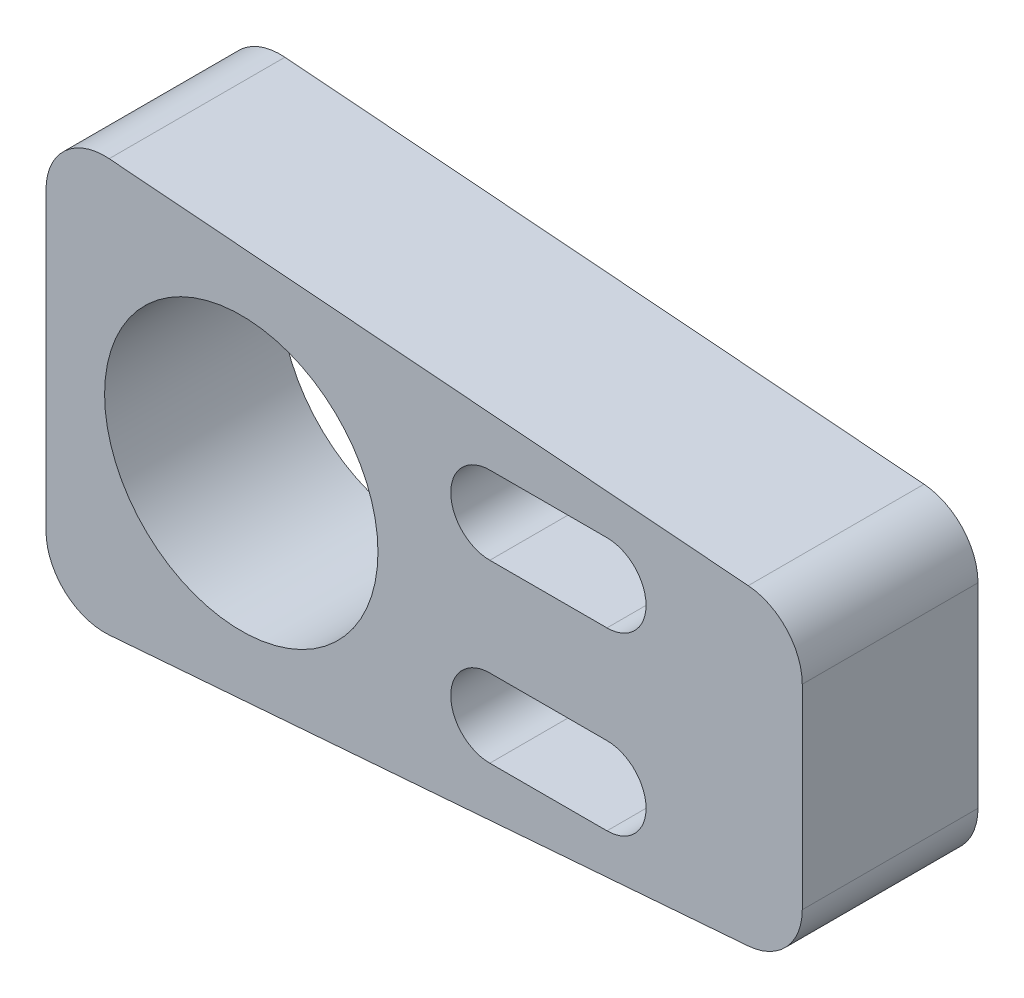
ISO-10303-21;
HEADER;
FILE_DESCRIPTION(('STEP AP214'),'2;1');
FILE_NAME('part.step','',(''),(''),'','','');
FILE_SCHEMA(('AUTOMOTIVE_DESIGN { 1 0 10303 214 1 1 1 1 }'));
ENDSEC;
DATA;
#1=APPLICATION_CONTEXT('core data for automotive mechanical design processes');
#2=APPLICATION_PROTOCOL_DEFINITION('international standard','automotive_design',2000,#1);
#3=PRODUCT_CONTEXT('',#1,'mechanical');
#4=PRODUCT('Part','Part','',(#3));
#5=PRODUCT_RELATED_PRODUCT_CATEGORY('part','',(#4));
#6=PRODUCT_DEFINITION_FORMATION('','',#4);
#7=PRODUCT_DEFINITION_CONTEXT('part definition',#1,'design');
#8=PRODUCT_DEFINITION('design','',#6,#7);
#9=PRODUCT_DEFINITION_SHAPE('','',#8);
#10=(LENGTH_UNIT() NAMED_UNIT(*) SI_UNIT(.MILLI.,.METRE.));
#11=(NAMED_UNIT(*) PLANE_ANGLE_UNIT() SI_UNIT($,.RADIAN.));
#12=(NAMED_UNIT(*) SI_UNIT($,.STERADIAN.) SOLID_ANGLE_UNIT());
#13=UNCERTAINTY_MEASURE_WITH_UNIT(LENGTH_MEASURE(1.E-05),#10,'distance_accuracy_value','');
#14=(GEOMETRIC_REPRESENTATION_CONTEXT(3) GLOBAL_UNCERTAINTY_ASSIGNED_CONTEXT((#13)) GLOBAL_UNIT_ASSIGNED_CONTEXT((#10,
#11,#12)) REPRESENTATION_CONTEXT('',''));
#15=CARTESIAN_POINT('',(0.,0.,0.));
#16=DIRECTION('',(0.,0.,1.));
#17=DIRECTION('',(1.,0.,0.));
#18=AXIS2_PLACEMENT_3D('',#15,#16,#17);
#19=CARTESIAN_POINT('',(0.,6.5,9.));
#20=DIRECTION('',(0.,-1.,0.));
#21=DIRECTION('',(0.,0.,-1.));
#22=AXIS2_PLACEMENT_3D('',#19,#20,#21);
#23=PLANE('',#22);
#24=DIRECTION('',(-1.,0.,0.));
#25=VECTOR('',#24,1.);
#26=CARTESIAN_POINT('',(0.,6.5,0.));
#27=LINE('',#26,#25);
#28=CARTESIAN_POINT('',(-114.44851042793,6.5,0.));
#29=VERTEX_POINT('',#28);
#30=CARTESIAN_POINT('',(-120.44851042793,6.5,0.));
#31=VERTEX_POINT('',#30);
#32=EDGE_CURVE('E219',#29,#31,#27,.T.);
#33=ORIENTED_EDGE('',*,*,#32,.F.);
#34=DIRECTION('',(0.,0.,-1.));
#35=VECTOR('',#34,1.);
#36=CARTESIAN_POINT('',(-114.44851042793,6.5,9.));
#37=LINE('',#36,#35);
#38=CARTESIAN_POINT('',(-114.44851042793,6.5,9.));
#39=VERTEX_POINT('',#38);
#40=EDGE_CURVE('E11',#39,#29,#37,.T.);
#41=ORIENTED_EDGE('',*,*,#40,.F.);
#42=DIRECTION('',(-1.,0.,0.));
#43=VECTOR('',#42,1.);
#44=CARTESIAN_POINT('',(0.,6.5,9.));
#45=LINE('',#44,#43);
#46=CARTESIAN_POINT('',(-120.44851042793,6.5,9.));
#47=VERTEX_POINT('',#46);
#48=EDGE_CURVE('E174',#39,#47,#45,.T.);
#49=ORIENTED_EDGE('',*,*,#48,.T.);
#50=DIRECTION('',(0.,0.,-1.));
#51=VECTOR('',#50,1.);
#52=CARTESIAN_POINT('',(-120.44851042793,6.5,9.));
#53=LINE('',#52,#51);
#54=EDGE_CURVE('E54',#47,#31,#53,.T.);
#55=ORIENTED_EDGE('',*,*,#54,.T.);
#56=EDGE_LOOP('',(#33,#41,#49,#55));
#57=FACE_BOUND('',#56,.T.);
#58=ADVANCED_FACE('F35',(#57),#23,.T.);
#59=CARTESIAN_POINT('',(-114.44851042793,4.5,9.));
#60=DIRECTION('',(0.,0.,-1.));
#61=DIRECTION('',(-1.,0.,0.));
#62=AXIS2_PLACEMENT_3D('',#59,#60,#61);
#63=CYLINDRICAL_SURFACE('',#62,2.);
#64=CARTESIAN_POINT('',(-114.44851042793,4.5,0.));
#65=DIRECTION('',(0.,0.,1.));
#66=DIRECTION('',(1.,0.,0.));
#67=AXIS2_PLACEMENT_3D('',#64,#65,#66);
#68=CIRCLE('',#67,2.);
#69=CARTESIAN_POINT('',(-114.44851042793,2.5,0.));
#70=VERTEX_POINT('',#69);
#71=EDGE_CURVE('E161',#70,#29,#68,.T.);
#72=ORIENTED_EDGE('',*,*,#71,.F.);
#73=DIRECTION('',(0.,0.,-1.));
#74=VECTOR('',#73,1.);
#75=CARTESIAN_POINT('',(-114.44851042793,2.5,9.));
#76=LINE('',#75,#74);
#77=CARTESIAN_POINT('',(-114.44851042793,2.5,9.));
#78=VERTEX_POINT('',#77);
#79=EDGE_CURVE('E45',#78,#70,#76,.T.);
#80=ORIENTED_EDGE('',*,*,#79,.F.);
#81=CARTESIAN_POINT('',(-114.44851042793,4.5,9.));
#82=DIRECTION('',(0.,0.,1.));
#83=DIRECTION('',(1.,0.,0.));
#84=AXIS2_PLACEMENT_3D('',#81,#82,#83);
#85=CIRCLE('',#84,2.);
#86=EDGE_CURVE('E159',#78,#39,#85,.T.);
#87=ORIENTED_EDGE('',*,*,#86,.T.);
#88=ORIENTED_EDGE('',*,*,#40,.T.);
#89=EDGE_LOOP('',(#72,#80,#87,#88));
#90=FACE_BOUND('',#89,.T.);
#91=ADVANCED_FACE('F157',(#90),#63,.F.);
#92=CARTESIAN_POINT('',(0.,2.5,9.));
#93=DIRECTION('',(0.,-1.,0.));
#94=DIRECTION('',(0.,0.,-1.));
#95=AXIS2_PLACEMENT_3D('',#92,#93,#94);
#96=PLANE('',#95);
#97=DIRECTION('',(-1.,0.,0.));
#98=VECTOR('',#97,1.);
#99=CARTESIAN_POINT('',(0.,2.5,0.));
#100=LINE('',#99,#98);
#101=CARTESIAN_POINT('',(-120.44851042793,2.5,0.));
#102=VERTEX_POINT('',#101);
#103=EDGE_CURVE('E222',#70,#102,#100,.T.);
#104=ORIENTED_EDGE('',*,*,#103,.T.);
#105=DIRECTION('',(0.,0.,-1.));
#106=VECTOR('',#105,1.);
#107=CARTESIAN_POINT('',(-120.44851042793,2.5,9.));
#108=LINE('',#107,#106);
#109=CARTESIAN_POINT('',(-120.44851042793,2.5,9.));
#110=VERTEX_POINT('',#109);
#111=EDGE_CURVE('E104',#110,#102,#108,.T.);
#112=ORIENTED_EDGE('',*,*,#111,.F.);
#113=DIRECTION('',(-1.,0.,0.));
#114=VECTOR('',#113,1.);
#115=CARTESIAN_POINT('',(0.,2.5,9.));
#116=LINE('',#115,#114);
#117=EDGE_CURVE('E165',#78,#110,#116,.T.);
#118=ORIENTED_EDGE('',*,*,#117,.F.);
#119=ORIENTED_EDGE('',*,*,#79,.T.);
#120=EDGE_LOOP('',(#104,#112,#118,#119));
#121=FACE_BOUND('',#120,.T.);
#122=ADVANCED_FACE('F166',(#121),#96,.F.);
#123=CARTESIAN_POINT('',(-120.44851042793,-4.5,9.));
#124=DIRECTION('',(0.,0.,-1.));
#125=DIRECTION('',(-1.,0.,0.));
#126=AXIS2_PLACEMENT_3D('',#123,#124,#125);
#127=CYLINDRICAL_SURFACE('',#126,2.);
#128=CARTESIAN_POINT('',(-120.44851042793,-4.5,0.));
#129=DIRECTION('',(0.,0.,1.));
#130=DIRECTION('',(1.,0.,0.));
#131=AXIS2_PLACEMENT_3D('',#128,#129,#130);
#132=CIRCLE('',#131,2.);
#133=CARTESIAN_POINT('',(-120.44851042793,-2.5,0.));
#134=VERTEX_POINT('',#133);
#135=CARTESIAN_POINT('',(-120.44851042793,-6.50000000000001,0.));
#136=VERTEX_POINT('',#135);
#137=EDGE_CURVE('E207',#134,#136,#132,.T.);
#138=ORIENTED_EDGE('',*,*,#137,.F.);
#139=DIRECTION('',(0.,0.,-1.));
#140=VECTOR('',#139,1.);
#141=CARTESIAN_POINT('',(-120.44851042793,-2.5,9.));
#142=LINE('',#141,#140);
#143=CARTESIAN_POINT('',(-120.44851042793,-2.5,9.));
#144=VERTEX_POINT('',#143);
#145=EDGE_CURVE('E232',#144,#134,#142,.T.);
#146=ORIENTED_EDGE('',*,*,#145,.F.);
#147=CARTESIAN_POINT('',(-120.44851042793,-4.5,9.));
#148=DIRECTION('',(0.,0.,1.));
#149=DIRECTION('',(1.,0.,0.));
#150=AXIS2_PLACEMENT_3D('',#147,#148,#149);
#151=CIRCLE('',#150,2.);
#152=CARTESIAN_POINT('',(-120.44851042793,-6.50000000000001,9.));
#153=VERTEX_POINT('',#152);
#154=EDGE_CURVE('E293',#144,#153,#151,.T.);
#155=ORIENTED_EDGE('',*,*,#154,.T.);
#156=DIRECTION('',(0.,0.,-1.));
#157=VECTOR('',#156,1.);
#158=CARTESIAN_POINT('',(-120.44851042793,-6.50000000000001,9.));
#159=LINE('',#158,#157);
#160=EDGE_CURVE('E234',#153,#136,#159,.T.);
#161=ORIENTED_EDGE('',*,*,#160,.T.);
#162=EDGE_LOOP('',(#138,#146,#155,#161));
#163=FACE_BOUND('',#162,.T.);
#164=ADVANCED_FACE('F311',(#163),#127,.F.);
#165=CARTESIAN_POINT('',(0.,-2.5,9.));
#166=DIRECTION('',(0.,-1.,0.));
#167=DIRECTION('',(0.,0.,-1.));
#168=AXIS2_PLACEMENT_3D('',#165,#166,#167);
#169=PLANE('',#168);
#170=DIRECTION('',(-1.,0.,0.));
#171=VECTOR('',#170,1.);
#172=CARTESIAN_POINT('',(0.,-2.5,0.));
#173=LINE('',#172,#171);
#174=CARTESIAN_POINT('',(-114.44851042793,-2.5,0.));
#175=VERTEX_POINT('',#174);
#176=EDGE_CURVE('E210',#175,#134,#173,.T.);
#177=ORIENTED_EDGE('',*,*,#176,.F.);
#178=DIRECTION('',(0.,0.,-1.));
#179=VECTOR('',#178,1.);
#180=CARTESIAN_POINT('',(-114.44851042793,-2.5,9.));
#181=LINE('',#180,#179);
#182=CARTESIAN_POINT('',(-114.44851042793,-2.5,9.));
#183=VERTEX_POINT('',#182);
#184=EDGE_CURVE('E238',#183,#175,#181,.T.);
#185=ORIENTED_EDGE('',*,*,#184,.F.);
#186=DIRECTION('',(-1.,0.,0.));
#187=VECTOR('',#186,1.);
#188=CARTESIAN_POINT('',(0.,-2.5,9.));
#189=LINE('',#188,#187);
#190=EDGE_CURVE('E296',#183,#144,#189,.T.);
#191=ORIENTED_EDGE('',*,*,#190,.T.);
#192=ORIENTED_EDGE('',*,*,#145,.T.);
#193=EDGE_LOOP('',(#177,#185,#191,#192));
#194=FACE_BOUND('',#193,.T.);
#195=ADVANCED_FACE('F314',(#194),#169,.T.);
#196=CARTESIAN_POINT('',(-114.44851042793,-4.5,9.));
#197=DIRECTION('',(0.,0.,-1.));
#198=DIRECTION('',(-1.,0.,0.));
#199=AXIS2_PLACEMENT_3D('',#196,#197,#198);
#200=CYLINDRICAL_SURFACE('',#199,2.);
#201=CARTESIAN_POINT('',(-114.44851042793,-4.5,0.));
#202=DIRECTION('',(0.,0.,1.));
#203=DIRECTION('',(1.,0.,0.));
#204=AXIS2_PLACEMENT_3D('',#201,#202,#203);
#205=CIRCLE('',#204,2.);
#206=CARTESIAN_POINT('',(-114.44851042793,-6.50000000000001,0.));
#207=VERTEX_POINT('',#206);
#208=EDGE_CURVE('E213',#207,#175,#205,.T.);
#209=ORIENTED_EDGE('',*,*,#208,.F.);
#210=DIRECTION('',(0.,0.,-1.));
#211=VECTOR('',#210,1.);
#212=CARTESIAN_POINT('',(-114.44851042793,-6.50000000000001,9.));
#213=LINE('',#212,#211);
#214=CARTESIAN_POINT('',(-114.44851042793,-6.50000000000001,9.));
#215=VERTEX_POINT('',#214);
#216=EDGE_CURVE('E236',#215,#207,#213,.T.);
#217=ORIENTED_EDGE('',*,*,#216,.F.);
#218=CARTESIAN_POINT('',(-114.44851042793,-4.5,9.));
#219=DIRECTION('',(0.,0.,1.));
#220=DIRECTION('',(1.,0.,0.));
#221=AXIS2_PLACEMENT_3D('',#218,#219,#220);
#222=CIRCLE('',#221,2.);
#223=EDGE_CURVE('E299',#215,#183,#222,.T.);
#224=ORIENTED_EDGE('',*,*,#223,.T.);
#225=ORIENTED_EDGE('',*,*,#184,.T.);
#226=EDGE_LOOP('',(#209,#217,#224,#225));
#227=FACE_BOUND('',#226,.T.);
#228=ADVANCED_FACE('F317',(#227),#200,.F.);
#229=CARTESIAN_POINT('',(-0.0338563368697226,-0.430878293590904,9.));
#230=DIRECTION('',(0.0783337275643138,0.996927192489943,0.));
#231=DIRECTION('',(-0.996927192489943,0.0783337275643138,0.));
#232=AXIS2_PLACEMENT_3D('',#229,#230,#231);
#233=PLANE('',#232);
#234=DIRECTION('',(0.996927192489943,-0.0783337275643138,0.));
#235=VECTOR('',#234,1.);
#236=CARTESIAN_POINT('',(-0.0338563368697226,-0.430878293590904,0.));
#237=LINE('',#236,#235);
#238=CARTESIAN_POINT('',(-139.941431306595,10.562383746428,0.));
#239=VERTEX_POINT('',#238);
#240=CARTESIAN_POINT('',(-107.213509245237,7.99078157746983,0.));
#241=VERTEX_POINT('',#240);
#242=EDGE_CURVE('E185',#239,#241,#237,.T.);
#243=ORIENTED_EDGE('',*,*,#242,.F.);
#244=DIRECTION('',(0.,0.,-1.));
#245=VECTOR('',#244,1.);
#246=CARTESIAN_POINT('',(-139.941431306595,10.562383746428,9.));
#247=LINE('',#246,#245);
#248=CARTESIAN_POINT('',(-139.941431306595,10.562383746428,9.));
#249=VERTEX_POINT('',#248);
#250=EDGE_CURVE('E39',#249,#239,#247,.T.);
#251=ORIENTED_EDGE('',*,*,#250,.F.);
#252=DIRECTION('',(0.996927192489943,-0.0783337275643138,0.));
#253=VECTOR('',#252,1.);
#254=CARTESIAN_POINT('',(-0.0338563368697226,-0.430878293590904,9.));
#255=LINE('',#254,#253);
#256=CARTESIAN_POINT('',(-107.213509245237,7.99078157746983,9.));
#257=VERTEX_POINT('',#256);
#258=EDGE_CURVE('E230',#249,#257,#255,.T.);
#259=ORIENTED_EDGE('',*,*,#258,.T.);
#260=DIRECTION('',(0.,0.,-1.));
#261=VECTOR('',#260,1.);
#262=CARTESIAN_POINT('',(-107.213509245237,7.99078157746983,9.));
#263=LINE('',#262,#261);
#264=EDGE_CURVE('E184',#257,#241,#263,.T.);
#265=ORIENTED_EDGE('',*,*,#264,.T.);
#266=EDGE_LOOP('',(#243,#251,#259,#265));
#267=FACE_BOUND('',#266,.T.);
#268=ADVANCED_FACE('F37',(#267),#233,.T.);
#269=CARTESIAN_POINT('',(-140.176432489288,7.57160216895814,9.));
#270=DIRECTION('',(0.,0.,-1.));
#271=DIRECTION('',(-1.,0.,0.));
#272=AXIS2_PLACEMENT_3D('',#269,#270,#271);
#273=CYLINDRICAL_SURFACE('',#272,3.00000000000001);
#274=CARTESIAN_POINT('',(-140.176432489288,7.57160216895814,0.));
#275=DIRECTION('',(0.,0.,1.));
#276=DIRECTION('',(1.,0.,0.));
#277=AXIS2_PLACEMENT_3D('',#274,#275,#276);
#278=CIRCLE('',#277,3.00000000000001);
#279=CARTESIAN_POINT('',(-143.176432489288,7.57160216895814,0.));
#280=VERTEX_POINT('',#279);
#281=EDGE_CURVE('E188',#280,#239,#278,.F.);
#282=ORIENTED_EDGE('',*,*,#281,.F.);
#283=DIRECTION('',(0.,0.,-1.));
#284=VECTOR('',#283,1.);
#285=CARTESIAN_POINT('',(-143.176432489288,7.57160216895814,9.));
#286=LINE('',#285,#284);
#287=CARTESIAN_POINT('',(-143.176432489288,7.57160216895814,9.));
#288=VERTEX_POINT('',#287);
#289=EDGE_CURVE('E253',#288,#280,#286,.T.);
#290=ORIENTED_EDGE('',*,*,#289,.F.);
#291=CARTESIAN_POINT('',(-140.176432489288,7.57160216895814,9.));
#292=DIRECTION('',(0.,0.,1.));
#293=DIRECTION('',(1.,0.,0.));
#294=AXIS2_PLACEMENT_3D('',#291,#292,#293);
#295=CIRCLE('',#294,3.00000000000001);
#296=EDGE_CURVE('E262',#288,#249,#295,.F.);
#297=ORIENTED_EDGE('',*,*,#296,.T.);
#298=ORIENTED_EDGE('',*,*,#250,.T.);
#299=EDGE_LOOP('',(#282,#290,#297,#298));
#300=FACE_BOUND('',#299,.T.);
#301=ADVANCED_FACE('F260',(#300),#273,.T.);
#302=CARTESIAN_POINT('',(-143.176432489288,0.,9.));
#303=DIRECTION('',(-1.,0.,0.));
#304=DIRECTION('',(0.,0.,1.));
#305=AXIS2_PLACEMENT_3D('',#302,#303,#304);
#306=PLANE('',#305);
#307=DIRECTION('',(0.,1.,0.));
#308=VECTOR('',#307,1.);
#309=CARTESIAN_POINT('',(-143.176432489288,0.,0.));
#310=LINE('',#309,#308);
#311=CARTESIAN_POINT('',(-143.176432489288,-7.57160216895814,0.));
#312=VERTEX_POINT('',#311);
#313=EDGE_CURVE('E191',#312,#280,#310,.T.);
#314=ORIENTED_EDGE('',*,*,#313,.F.);
#315=DIRECTION('',(0.,0.,-1.));
#316=VECTOR('',#315,1.);
#317=CARTESIAN_POINT('',(-143.176432489288,-7.57160216895814,9.));
#318=LINE('',#317,#316);
#319=CARTESIAN_POINT('',(-143.176432489288,-7.57160216895814,9.));
#320=VERTEX_POINT('',#319);
#321=EDGE_CURVE('E252',#320,#312,#318,.T.);
#322=ORIENTED_EDGE('',*,*,#321,.F.);
#323=DIRECTION('',(0.,1.,0.));
#324=VECTOR('',#323,1.);
#325=CARTESIAN_POINT('',(-143.176432489288,0.,9.));
#326=LINE('',#325,#324);
#327=EDGE_CURVE('E271',#320,#288,#326,.T.);
#328=ORIENTED_EDGE('',*,*,#327,.T.);
#329=ORIENTED_EDGE('',*,*,#289,.T.);
#330=EDGE_LOOP('',(#314,#322,#328,#329));
#331=FACE_BOUND('',#330,.T.);
#332=ADVANCED_FACE('F269',(#331),#306,.T.);
#333=CARTESIAN_POINT('',(-140.176432489288,-7.57160216895814,9.));
#334=DIRECTION('',(0.,0.,-1.));
#335=DIRECTION('',(-1.,0.,0.));
#336=AXIS2_PLACEMENT_3D('',#333,#334,#335);
#337=CYLINDRICAL_SURFACE('',#336,3.00000000000001);
#338=CARTESIAN_POINT('',(-140.176432489288,-7.57160216895814,0.));
#339=DIRECTION('',(0.,0.,1.));
#340=DIRECTION('',(1.,0.,0.));
#341=AXIS2_PLACEMENT_3D('',#338,#339,#340);
#342=CIRCLE('',#341,3.00000000000001);
#343=CARTESIAN_POINT('',(-139.941431306595,-10.562383746428,0.));
#344=VERTEX_POINT('',#343);
#345=EDGE_CURVE('E194',#344,#312,#342,.F.);
#346=ORIENTED_EDGE('',*,*,#345,.F.);
#347=DIRECTION('',(0.,0.,-1.));
#348=VECTOR('',#347,1.);
#349=CARTESIAN_POINT('',(-139.941431306595,-10.562383746428,9.));
#350=LINE('',#349,#348);
#351=CARTESIAN_POINT('',(-139.941431306595,-10.562383746428,9.));
#352=VERTEX_POINT('',#351);
#353=EDGE_CURVE('E250',#352,#344,#350,.T.);
#354=ORIENTED_EDGE('',*,*,#353,.F.);
#355=CARTESIAN_POINT('',(-140.176432489288,-7.57160216895814,9.));
#356=DIRECTION('',(0.,0.,1.));
#357=DIRECTION('',(1.,0.,0.));
#358=AXIS2_PLACEMENT_3D('',#355,#356,#357);
#359=CIRCLE('',#358,3.00000000000001);
#360=EDGE_CURVE('E277',#352,#320,#359,.F.);
#361=ORIENTED_EDGE('',*,*,#360,.T.);
#362=ORIENTED_EDGE('',*,*,#321,.T.);
#363=EDGE_LOOP('',(#346,#354,#361,#362));
#364=FACE_BOUND('',#363,.T.);
#365=ADVANCED_FACE('F279',(#364),#337,.T.);
#366=CARTESIAN_POINT('',(-0.0338563368697223,0.430878293590901,9.));
#367=DIRECTION('',(-0.0783337275643138,0.996927192489943,0.));
#368=DIRECTION('',(-0.996927192489943,-0.0783337275643138,0.));
#369=AXIS2_PLACEMENT_3D('',#366,#367,#368);
#370=PLANE('',#369);
#371=DIRECTION('',(0.996927192489943,0.0783337275643138,0.));
#372=VECTOR('',#371,1.);
#373=CARTESIAN_POINT('',(-0.0338563368697223,0.430878293590901,0.));
#374=LINE('',#373,#372);
#375=CARTESIAN_POINT('',(-107.213509245237,-7.99078157746983,0.));
#376=VERTEX_POINT('',#375);
#377=EDGE_CURVE('E197',#344,#376,#374,.T.);
#378=ORIENTED_EDGE('',*,*,#377,.T.);
#379=DIRECTION('',(0.,0.,-1.));
#380=VECTOR('',#379,1.);
#381=CARTESIAN_POINT('',(-107.213509245237,-7.99078157746983,9.));
#382=LINE('',#381,#380);
#383=CARTESIAN_POINT('',(-107.213509245237,-7.99078157746983,9.));
#384=VERTEX_POINT('',#383);
#385=EDGE_CURVE('E247',#384,#376,#382,.T.);
#386=ORIENTED_EDGE('',*,*,#385,.F.);
#387=DIRECTION('',(0.996927192489943,0.0783337275643138,0.));
#388=VECTOR('',#387,1.);
#389=CARTESIAN_POINT('',(-0.0338563368697223,0.430878293590901,9.));
#390=LINE('',#389,#388);
#391=EDGE_CURVE('E281',#352,#384,#390,.T.);
#392=ORIENTED_EDGE('',*,*,#391,.F.);
#393=ORIENTED_EDGE('',*,*,#353,.T.);
#394=EDGE_LOOP('',(#378,#386,#392,#393));
#395=FACE_BOUND('',#394,.T.);
#396=ADVANCED_FACE('F361',(#395),#370,.F.);
#397=CARTESIAN_POINT('',(-107.44851042793,-5.,9.));
#398=DIRECTION('',(0.,0.,-1.));
#399=DIRECTION('',(-1.,0.,0.));
#400=AXIS2_PLACEMENT_3D('',#397,#398,#399);
#401=CYLINDRICAL_SURFACE('',#400,3.);
#402=CARTESIAN_POINT('',(-107.44851042793,-5.,0.));
#403=DIRECTION('',(0.,0.,1.));
#404=DIRECTION('',(1.,0.,0.));
#405=AXIS2_PLACEMENT_3D('',#402,#403,#404);
#406=CIRCLE('',#405,3.);
#407=CARTESIAN_POINT('',(-104.44851042793,-5.,0.));
#408=VERTEX_POINT('',#407);
#409=EDGE_CURVE('E199',#376,#408,#406,.T.);
#410=ORIENTED_EDGE('',*,*,#409,.T.);
#411=DIRECTION('',(0.,0.,-1.));
#412=VECTOR('',#411,1.);
#413=CARTESIAN_POINT('',(-104.44851042793,-5.,9.));
#414=LINE('',#413,#412);
#415=CARTESIAN_POINT('',(-104.44851042793,-5.,9.));
#416=VERTEX_POINT('',#415);
#417=EDGE_CURVE('E244',#416,#408,#414,.T.);
#418=ORIENTED_EDGE('',*,*,#417,.F.);
#419=CARTESIAN_POINT('',(-107.44851042793,-5.,9.));
#420=DIRECTION('',(0.,0.,1.));
#421=DIRECTION('',(1.,0.,0.));
#422=AXIS2_PLACEMENT_3D('',#419,#420,#421);
#423=CIRCLE('',#422,3.);
#424=EDGE_CURVE('E283',#384,#416,#423,.T.);
#425=ORIENTED_EDGE('',*,*,#424,.F.);
#426=ORIENTED_EDGE('',*,*,#385,.T.);
#427=EDGE_LOOP('',(#410,#418,#425,#426));
#428=FACE_BOUND('',#427,.T.);
#429=ADVANCED_FACE('F357',(#428),#401,.T.);
#430=CARTESIAN_POINT('',(-104.44851042793,0.,9.));
#431=DIRECTION('',(-1.,0.,0.));
#432=DIRECTION('',(0.,0.,1.));
#433=AXIS2_PLACEMENT_3D('',#430,#431,#432);
#434=PLANE('',#433);
#435=DIRECTION('',(0.,1.,0.));
#436=VECTOR('',#435,1.);
#437=CARTESIAN_POINT('',(-104.44851042793,0.,0.));
#438=LINE('',#437,#436);
#439=CARTESIAN_POINT('',(-104.44851042793,5.,0.));
#440=VERTEX_POINT('',#439);
#441=EDGE_CURVE('E201',#408,#440,#438,.T.);
#442=ORIENTED_EDGE('',*,*,#441,.T.);
#443=DIRECTION('',(0.,0.,-1.));
#444=VECTOR('',#443,1.);
#445=CARTESIAN_POINT('',(-104.44851042793,5.,9.));
#446=LINE('',#445,#444);
#447=CARTESIAN_POINT('',(-104.44851042793,5.,9.));
#448=VERTEX_POINT('',#447);
#449=EDGE_CURVE('E242',#448,#440,#446,.T.);
#450=ORIENTED_EDGE('',*,*,#449,.F.);
#451=DIRECTION('',(0.,1.,0.));
#452=VECTOR('',#451,1.);
#453=CARTESIAN_POINT('',(-104.44851042793,0.,9.));
#454=LINE('',#453,#452);
#455=EDGE_CURVE('E288',#416,#448,#454,.T.);
#456=ORIENTED_EDGE('',*,*,#455,.F.);
#457=ORIENTED_EDGE('',*,*,#417,.T.);
#458=EDGE_LOOP('',(#442,#450,#456,#457));
#459=FACE_BOUND('',#458,.T.);
#460=ADVANCED_FACE('F354',(#459),#434,.F.);
#461=CARTESIAN_POINT('',(-120.44851042793,4.5,9.));
#462=DIRECTION('',(0.,0.,-1.));
#463=DIRECTION('',(-1.,0.,0.));
#464=AXIS2_PLACEMENT_3D('',#461,#462,#463);
#465=CYLINDRICAL_SURFACE('',#464,2.);
#466=CARTESIAN_POINT('',(-120.44851042793,4.5,0.));
#467=DIRECTION('',(0.,0.,1.));
#468=DIRECTION('',(1.,0.,0.));
#469=AXIS2_PLACEMENT_3D('',#466,#467,#468);
#470=CIRCLE('',#469,2.);
#471=EDGE_CURVE('E224',#31,#102,#470,.T.);
#472=ORIENTED_EDGE('',*,*,#471,.F.);
#473=ORIENTED_EDGE('',*,*,#54,.F.);
#474=CARTESIAN_POINT('',(-120.44851042793,4.5,9.));
#475=DIRECTION('',(0.,0.,1.));
#476=DIRECTION('',(1.,0.,0.));
#477=AXIS2_PLACEMENT_3D('',#474,#475,#476);
#478=CIRCLE('',#477,2.);
#479=EDGE_CURVE('E169',#47,#110,#478,.T.);
#480=ORIENTED_EDGE('',*,*,#479,.T.);
#481=ORIENTED_EDGE('',*,*,#111,.T.);
#482=EDGE_LOOP('',(#472,#473,#480,#481));
#483=FACE_BOUND('',#482,.T.);
#484=ADVANCED_FACE('F347',(#483),#465,.F.);
#485=CARTESIAN_POINT('',(0.,-6.50000000000001,9.));
#486=DIRECTION('',(0.,-1.,0.));
#487=DIRECTION('',(0.,0.,-1.));
#488=AXIS2_PLACEMENT_3D('',#485,#486,#487);
#489=PLANE('',#488);
#490=DIRECTION('',(-1.,0.,0.));
#491=VECTOR('',#490,1.);
#492=CARTESIAN_POINT('',(0.,-6.50000000000001,0.));
#493=LINE('',#492,#491);
#494=EDGE_CURVE('E216',#207,#136,#493,.T.);
#495=ORIENTED_EDGE('',*,*,#494,.T.);
#496=ORIENTED_EDGE('',*,*,#160,.F.);
#497=DIRECTION('',(-1.,0.,0.));
#498=VECTOR('',#497,1.);
#499=CARTESIAN_POINT('',(0.,-6.50000000000001,9.));
#500=LINE('',#499,#498);
#501=EDGE_CURVE('E176',#215,#153,#500,.T.);
#502=ORIENTED_EDGE('',*,*,#501,.F.);
#503=ORIENTED_EDGE('',*,*,#216,.T.);
#504=EDGE_LOOP('',(#495,#496,#502,#503));
#505=FACE_BOUND('',#504,.T.);
#506=ADVANCED_FACE('F307',(#505),#489,.F.);
#507=CARTESIAN_POINT('',(-107.44851042793,5.,9.));
#508=DIRECTION('',(0.,0.,-1.));
#509=DIRECTION('',(-1.,0.,0.));
#510=AXIS2_PLACEMENT_3D('',#507,#508,#509);
#511=CYLINDRICAL_SURFACE('',#510,3.);
#512=CARTESIAN_POINT('',(-107.44851042793,5.,0.));
#513=DIRECTION('',(0.,0.,1.));
#514=DIRECTION('',(1.,0.,0.));
#515=AXIS2_PLACEMENT_3D('',#512,#513,#514);
#516=CIRCLE('',#515,3.);
#517=EDGE_CURVE('E204',#241,#440,#516,.F.);
#518=ORIENTED_EDGE('',*,*,#517,.F.);
#519=ORIENTED_EDGE('',*,*,#264,.F.);
#520=CARTESIAN_POINT('',(-107.44851042793,5.,9.));
#521=DIRECTION('',(0.,0.,1.));
#522=DIRECTION('',(1.,0.,0.));
#523=AXIS2_PLACEMENT_3D('',#520,#521,#522);
#524=CIRCLE('',#523,3.);
#525=EDGE_CURVE('E290',#257,#448,#524,.F.);
#526=ORIENTED_EDGE('',*,*,#525,.T.);
#527=ORIENTED_EDGE('',*,*,#449,.T.);
#528=EDGE_LOOP('',(#518,#519,#526,#527));
#529=FACE_BOUND('',#528,.T.);
#530=ADVANCED_FACE('F326',(#529),#511,.T.);
#531=CARTESIAN_POINT('',(-133.176432489288,0.,9.));
#532=DIRECTION('',(0.,0.,-1.));
#533=DIRECTION('',(-1.,0.,0.));
#534=AXIS2_PLACEMENT_3D('',#531,#532,#533);
#535=CYLINDRICAL_SURFACE('',#534,7.00000000000001);
#536=CARTESIAN_POINT('',(-133.176432489288,0.,9.));
#537=DIRECTION('',(0.,0.,1.));
#538=DIRECTION('',(1.,0.,0.));
#539=AXIS2_PLACEMENT_3D('',#536,#537,#538);
#540=CIRCLE('',#539,7.00000000000001);
#541=CARTESIAN_POINT('',(-126.176432489288,0.,9.));
#542=VERTEX_POINT('',#541);
#543=EDGE_CURVE('E181',#542,#542,#540,.T.);
#544=ORIENTED_EDGE('',*,*,#543,.T.);
#545=EDGE_LOOP('',(#544));
#546=FACE_BOUND('',#545,.T.);
#547=CARTESIAN_POINT('',(-133.176432489288,0.,0.));
#548=DIRECTION('',(0.,0.,1.));
#549=DIRECTION('',(1.,0.,0.));
#550=AXIS2_PLACEMENT_3D('',#547,#548,#549);
#551=CIRCLE('',#550,7.00000000000001);
#552=CARTESIAN_POINT('',(-126.176432489288,0.,0.));
#553=VERTEX_POINT('',#552);
#554=EDGE_CURVE('E227',#553,#553,#551,.T.);
#555=ORIENTED_EDGE('',*,*,#554,.F.);
#556=EDGE_LOOP('',(#555));
#557=FACE_BOUND('',#556,.T.);
#558=ADVANCED_FACE('F324',(#546,#557),#535,.F.);
#559=CARTESIAN_POINT('',(0.,0.,9.));
#560=DIRECTION('',(0.,0.,1.));
#561=DIRECTION('',(1.,0.,0.));
#562=AXIS2_PLACEMENT_3D('',#559,#560,#561);
#563=PLANE('',#562);
#564=ORIENTED_EDGE('',*,*,#258,.F.);
#565=ORIENTED_EDGE('',*,*,#296,.F.);
#566=ORIENTED_EDGE('',*,*,#327,.F.);
#567=ORIENTED_EDGE('',*,*,#360,.F.);
#568=ORIENTED_EDGE('',*,*,#391,.T.);
#569=ORIENTED_EDGE('',*,*,#424,.T.);
#570=ORIENTED_EDGE('',*,*,#455,.T.);
#571=ORIENTED_EDGE('',*,*,#525,.F.);
#572=EDGE_LOOP('',(#564,#565,#566,#567,#568,#569,#570,#571));
#573=FACE_BOUND('',#572,.T.);
#574=ORIENTED_EDGE('',*,*,#154,.F.);
#575=ORIENTED_EDGE('',*,*,#190,.F.);
#576=ORIENTED_EDGE('',*,*,#223,.F.);
#577=ORIENTED_EDGE('',*,*,#501,.T.);
#578=EDGE_LOOP('',(#574,#575,#576,#577));
#579=FACE_BOUND('',#578,.T.);
#580=ORIENTED_EDGE('',*,*,#48,.F.);
#581=ORIENTED_EDGE('',*,*,#86,.F.);
#582=ORIENTED_EDGE('',*,*,#117,.T.);
#583=ORIENTED_EDGE('',*,*,#479,.F.);
#584=EDGE_LOOP('',(#580,#581,#582,#583));
#585=FACE_BOUND('',#584,.T.);
#586=ORIENTED_EDGE('',*,*,#543,.F.);
#587=EDGE_LOOP('',(#586));
#588=FACE_BOUND('',#587,.T.);
#589=ADVANCED_FACE('F172',(#573,#579,#585,#588),#563,.T.);
#590=CARTESIAN_POINT('',(0.,0.,0.));
#591=DIRECTION('',(0.,0.,1.));
#592=DIRECTION('',(1.,0.,0.));
#593=AXIS2_PLACEMENT_3D('',#590,#591,#592);
#594=PLANE('',#593);
#595=ORIENTED_EDGE('',*,*,#242,.T.);
#596=ORIENTED_EDGE('',*,*,#517,.T.);
#597=ORIENTED_EDGE('',*,*,#441,.F.);
#598=ORIENTED_EDGE('',*,*,#409,.F.);
#599=ORIENTED_EDGE('',*,*,#377,.F.);
#600=ORIENTED_EDGE('',*,*,#345,.T.);
#601=ORIENTED_EDGE('',*,*,#313,.T.);
#602=ORIENTED_EDGE('',*,*,#281,.T.);
#603=EDGE_LOOP('',(#595,#596,#597,#598,#599,#600,#601,#602));
#604=FACE_BOUND('',#603,.T.);
#605=ORIENTED_EDGE('',*,*,#137,.T.);
#606=ORIENTED_EDGE('',*,*,#494,.F.);
#607=ORIENTED_EDGE('',*,*,#208,.T.);
#608=ORIENTED_EDGE('',*,*,#176,.T.);
#609=EDGE_LOOP('',(#605,#606,#607,#608));
#610=FACE_BOUND('',#609,.T.);
#611=ORIENTED_EDGE('',*,*,#32,.T.);
#612=ORIENTED_EDGE('',*,*,#471,.T.);
#613=ORIENTED_EDGE('',*,*,#103,.F.);
#614=ORIENTED_EDGE('',*,*,#71,.T.);
#615=EDGE_LOOP('',(#611,#612,#613,#614));
#616=FACE_BOUND('',#615,.T.);
#617=ORIENTED_EDGE('',*,*,#554,.T.);
#618=EDGE_LOOP('',(#617));
#619=FACE_BOUND('',#618,.T.);
#620=ADVANCED_FACE('F265',(#604,#610,#616,#619),#594,.F.);
#621=CLOSED_SHELL('',(#58,#91,#122,#164,#195,#228,#268,#301,#332,#365,#396,#429,#460,#484,#506,
#530,#558,#589,#620));
#622=MANIFOLD_SOLID_BREP('B2',#621);
#623=ADVANCED_BREP_SHAPE_REPRESENTATION('',(#18,#622),#14);
#624=SHAPE_DEFINITION_REPRESENTATION(#9,#623);
ENDSEC;
END-ISO-10303-21;
